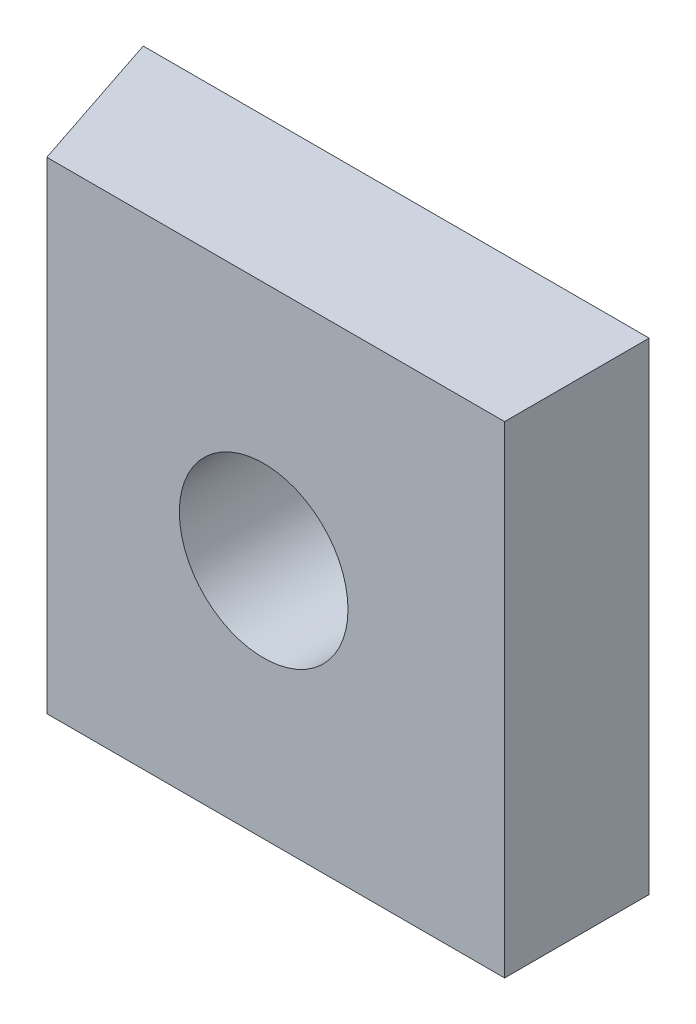
ISO-10303-21;
HEADER;
FILE_DESCRIPTION(('STEP AP214'),'2;1');
FILE_NAME('part.step','',(''),(''),'','','');
FILE_SCHEMA(('AUTOMOTIVE_DESIGN { 1 0 10303 214 1 1 1 1 }'));
ENDSEC;
DATA;
#1=APPLICATION_CONTEXT('core data for automotive mechanical design processes');
#2=APPLICATION_PROTOCOL_DEFINITION('international standard','automotive_design',2000,#1);
#3=PRODUCT_CONTEXT('',#1,'mechanical');
#4=PRODUCT('Part','Part','',(#3));
#5=PRODUCT_RELATED_PRODUCT_CATEGORY('part','',(#4));
#6=PRODUCT_DEFINITION_FORMATION('','',#4);
#7=PRODUCT_DEFINITION_CONTEXT('part definition',#1,'design');
#8=PRODUCT_DEFINITION('design','',#6,#7);
#9=PRODUCT_DEFINITION_SHAPE('','',#8);
#10=(LENGTH_UNIT() NAMED_UNIT(*) SI_UNIT(.MILLI.,.METRE.));
#11=(NAMED_UNIT(*) PLANE_ANGLE_UNIT() SI_UNIT($,.RADIAN.));
#12=(NAMED_UNIT(*) SI_UNIT($,.STERADIAN.) SOLID_ANGLE_UNIT());
#13=UNCERTAINTY_MEASURE_WITH_UNIT(LENGTH_MEASURE(1.E-05),#10,'distance_accuracy_value','');
#14=(GEOMETRIC_REPRESENTATION_CONTEXT(3) GLOBAL_UNCERTAINTY_ASSIGNED_CONTEXT((#13)) GLOBAL_UNIT_ASSIGNED_CONTEXT((#10,
#11,#12)) REPRESENTATION_CONTEXT('',''));
#15=CARTESIAN_POINT('',(0.,0.,0.));
#16=DIRECTION('',(0.,0.,1.));
#17=DIRECTION('',(1.,0.,0.));
#18=AXIS2_PLACEMENT_3D('',#15,#16,#17);
#19=CARTESIAN_POINT('',(-9.5,10.,0.));
#20=DIRECTION('',(0.,0.,-1.));
#21=DIRECTION('',(-1.,0.,0.));
#22=AXIS2_PLACEMENT_3D('',#19,#20,#21);
#23=PLANE('',#22);
#24=CARTESIAN_POINT('',(-5.,5.,0.));
#25=DIRECTION('',(0.,0.,-1.));
#26=DIRECTION('',(-1.,0.,0.));
#27=AXIS2_PLACEMENT_3D('',#24,#25,#26);
#28=CIRCLE('',#27,1.75);
#29=CARTESIAN_POINT('',(-6.75,5.,0.));
#30=VERTEX_POINT('',#29);
#31=EDGE_CURVE('E98',#30,#30,#28,.T.);
#32=ORIENTED_EDGE('',*,*,#31,.T.);
#33=EDGE_LOOP('',(#32));
#34=FACE_BOUND('',#33,.T.);
#35=DIRECTION('',(1.,0.,0.));
#36=VECTOR('',#35,1.);
#37=CARTESIAN_POINT('',(-9.5,0.,0.));
#38=LINE('',#37,#36);
#39=CARTESIAN_POINT('',(-9.5,0.,0.));
#40=VERTEX_POINT('',#39);
#41=CARTESIAN_POINT('',(0.,0.,0.));
#42=VERTEX_POINT('',#41);
#43=EDGE_CURVE('E95',#40,#42,#38,.T.);
#44=ORIENTED_EDGE('',*,*,#43,.T.);
#45=DIRECTION('',(0.,-1.,0.));
#46=VECTOR('',#45,1.);
#47=CARTESIAN_POINT('',(0.,10.,0.));
#48=LINE('',#47,#46);
#49=CARTESIAN_POINT('',(0.,10.,0.));
#50=VERTEX_POINT('',#49);
#51=EDGE_CURVE('E11',#50,#42,#48,.T.);
#52=ORIENTED_EDGE('',*,*,#51,.F.);
#53=DIRECTION('',(1.,0.,0.));
#54=VECTOR('',#53,1.);
#55=CARTESIAN_POINT('',(-9.5,10.,0.));
#56=LINE('',#55,#54);
#57=CARTESIAN_POINT('',(-9.5,10.,0.));
#58=VERTEX_POINT('',#57);
#59=EDGE_CURVE('E83',#58,#50,#56,.T.);
#60=ORIENTED_EDGE('',*,*,#59,.F.);
#61=DIRECTION('',(0.,-1.,0.));
#62=VECTOR('',#61,1.);
#63=CARTESIAN_POINT('',(-9.5,10.,0.));
#64=LINE('',#63,#62);
#65=EDGE_CURVE('E91',#58,#40,#64,.T.);
#66=ORIENTED_EDGE('',*,*,#65,.T.);
#67=EDGE_LOOP('',(#44,#52,#60,#66));
#68=FACE_BOUND('',#67,.T.);
#69=ADVANCED_FACE('F32',(#34,#68),#23,.F.);
#70=CARTESIAN_POINT('',(0.,10.,0.));
#71=DIRECTION('',(-1.,0.,0.));
#72=DIRECTION('',(0.,0.,1.));
#73=AXIS2_PLACEMENT_3D('',#70,#71,#72);
#74=PLANE('',#73);
#75=DIRECTION('',(0.,0.,-1.));
#76=VECTOR('',#75,1.);
#77=CARTESIAN_POINT('',(0.,0.,0.));
#78=LINE('',#77,#76);
#79=CARTESIAN_POINT('',(0.,0.,-3.));
#80=VERTEX_POINT('',#79);
#81=EDGE_CURVE('E87',#42,#80,#78,.T.);
#82=ORIENTED_EDGE('',*,*,#81,.T.);
#83=DIRECTION('',(0.,-1.,0.));
#84=VECTOR('',#83,1.);
#85=CARTESIAN_POINT('',(0.,10.,-3.));
#86=LINE('',#85,#84);
#87=CARTESIAN_POINT('',(0.,10.,-3.));
#88=VERTEX_POINT('',#87);
#89=EDGE_CURVE('E40',#88,#80,#86,.T.);
#90=ORIENTED_EDGE('',*,*,#89,.F.);
#91=DIRECTION('',(0.,0.,-1.));
#92=VECTOR('',#91,1.);
#93=CARTESIAN_POINT('',(0.,10.,0.));
#94=LINE('',#93,#92);
#95=EDGE_CURVE('E78',#50,#88,#94,.T.);
#96=ORIENTED_EDGE('',*,*,#95,.F.);
#97=ORIENTED_EDGE('',*,*,#51,.T.);
#98=EDGE_LOOP('',(#82,#90,#96,#97));
#99=FACE_BOUND('',#98,.T.);
#100=ADVANCED_FACE('F86',(#99),#74,.F.);
#101=CARTESIAN_POINT('',(0.,10.,-3.));
#102=DIRECTION('',(0.,0.,1.));
#103=DIRECTION('',(1.,0.,0.));
#104=AXIS2_PLACEMENT_3D('',#101,#102,#103);
#105=PLANE('',#104);
#106=CARTESIAN_POINT('',(-5.,5.,-3.));
#107=DIRECTION('',(0.,0.,-1.));
#108=DIRECTION('',(-1.,0.,0.));
#109=AXIS2_PLACEMENT_3D('',#106,#107,#108);
#110=CIRCLE('',#109,1.75);
#111=CARTESIAN_POINT('',(-6.75,5.,-3.));
#112=VERTEX_POINT('',#111);
#113=EDGE_CURVE('E109',#112,#112,#110,.T.);
#114=ORIENTED_EDGE('',*,*,#113,.F.);
#115=EDGE_LOOP('',(#114));
#116=FACE_BOUND('',#115,.T.);
#117=DIRECTION('',(-1.,0.,0.));
#118=VECTOR('',#117,1.);
#119=CARTESIAN_POINT('',(0.,0.,-3.));
#120=LINE('',#119,#118);
#121=CARTESIAN_POINT('',(-10.5,0.,-3.));
#122=VERTEX_POINT('',#121);
#123=EDGE_CURVE('E65',#80,#122,#120,.T.);
#124=ORIENTED_EDGE('',*,*,#123,.T.);
#125=DIRECTION('',(0.,-1.,0.));
#126=VECTOR('',#125,1.);
#127=CARTESIAN_POINT('',(-10.5,10.,-3.));
#128=LINE('',#127,#126);
#129=CARTESIAN_POINT('',(-10.5,10.,-3.));
#130=VERTEX_POINT('',#129);
#131=EDGE_CURVE('E88',#130,#122,#128,.T.);
#132=ORIENTED_EDGE('',*,*,#131,.F.);
#133=DIRECTION('',(-1.,0.,0.));
#134=VECTOR('',#133,1.);
#135=CARTESIAN_POINT('',(0.,10.,-3.));
#136=LINE('',#135,#134);
#137=EDGE_CURVE('E81',#88,#130,#136,.T.);
#138=ORIENTED_EDGE('',*,*,#137,.F.);
#139=ORIENTED_EDGE('',*,*,#89,.T.);
#140=EDGE_LOOP('',(#124,#132,#138,#139));
#141=FACE_BOUND('',#140,.T.);
#142=ADVANCED_FACE('F89',(#116,#141),#105,.F.);
#143=CARTESIAN_POINT('',(-10.5,10.,-3.));
#144=DIRECTION('',(0.948683298050514,0.,-0.316227766016838));
#145=DIRECTION('',(-0.316227766016838,0.,-0.948683298050514));
#146=AXIS2_PLACEMENT_3D('',#143,#144,#145);
#147=PLANE('',#146);
#148=DIRECTION('',(0.316227766016838,0.,0.948683298050514));
#149=VECTOR('',#148,1.);
#150=CARTESIAN_POINT('',(-10.5,0.,-3.));
#151=LINE('',#150,#149);
#152=EDGE_CURVE('E71',#122,#40,#151,.T.);
#153=ORIENTED_EDGE('',*,*,#152,.T.);
#154=ORIENTED_EDGE('',*,*,#65,.F.);
#155=DIRECTION('',(0.316227766016838,0.,0.948683298050514));
#156=VECTOR('',#155,1.);
#157=CARTESIAN_POINT('',(-10.5,10.,-3.));
#158=LINE('',#157,#156);
#159=EDGE_CURVE('E48',#130,#58,#158,.T.);
#160=ORIENTED_EDGE('',*,*,#159,.F.);
#161=ORIENTED_EDGE('',*,*,#131,.T.);
#162=EDGE_LOOP('',(#153,#154,#160,#161));
#163=FACE_BOUND('',#162,.T.);
#164=ADVANCED_FACE('F103',(#163),#147,.F.);
#165=CARTESIAN_POINT('',(0.,10.,0.));
#166=DIRECTION('',(0.,1.,0.));
#167=DIRECTION('',(0.,0.,1.));
#168=AXIS2_PLACEMENT_3D('',#165,#166,#167);
#169=PLANE('',#168);
#170=ORIENTED_EDGE('',*,*,#59,.T.);
#171=ORIENTED_EDGE('',*,*,#95,.T.);
#172=ORIENTED_EDGE('',*,*,#137,.T.);
#173=ORIENTED_EDGE('',*,*,#159,.T.);
#174=EDGE_LOOP('',(#170,#171,#172,#173));
#175=FACE_BOUND('',#174,.T.);
#176=ADVANCED_FACE('F79',(#175),#169,.T.);
#177=CARTESIAN_POINT('',(0.,0.,0.));
#178=DIRECTION('',(0.,1.,0.));
#179=DIRECTION('',(0.,0.,1.));
#180=AXIS2_PLACEMENT_3D('',#177,#178,#179);
#181=PLANE('',#180);
#182=ORIENTED_EDGE('',*,*,#43,.F.);
#183=ORIENTED_EDGE('',*,*,#152,.F.);
#184=ORIENTED_EDGE('',*,*,#123,.F.);
#185=ORIENTED_EDGE('',*,*,#81,.F.);
#186=EDGE_LOOP('',(#182,#183,#184,#185));
#187=FACE_BOUND('',#186,.T.);
#188=ADVANCED_FACE('F106',(#187),#181,.F.);
#189=CARTESIAN_POINT('',(-5.,5.,0.));
#190=DIRECTION('',(0.,0.,-1.));
#191=DIRECTION('',(-1.,0.,0.));
#192=AXIS2_PLACEMENT_3D('',#189,#190,#191);
#193=CYLINDRICAL_SURFACE('',#192,1.75);
#194=ORIENTED_EDGE('',*,*,#31,.F.);
#195=EDGE_LOOP('',(#194));
#196=FACE_BOUND('',#195,.T.);
#197=ORIENTED_EDGE('',*,*,#113,.T.);
#198=EDGE_LOOP('',(#197));
#199=FACE_BOUND('',#198,.T.);
#200=ADVANCED_FACE('F116',(#196,#199),#193,.F.);
#201=CLOSED_SHELL('',(#69,#100,#142,#164,#176,#188,#200));
#202=MANIFOLD_SOLID_BREP('B2',#201);
#203=ADVANCED_BREP_SHAPE_REPRESENTATION('',(#18,#202),#14);
#204=SHAPE_DEFINITION_REPRESENTATION(#9,#203);
ENDSEC;
END-ISO-10303-21;
